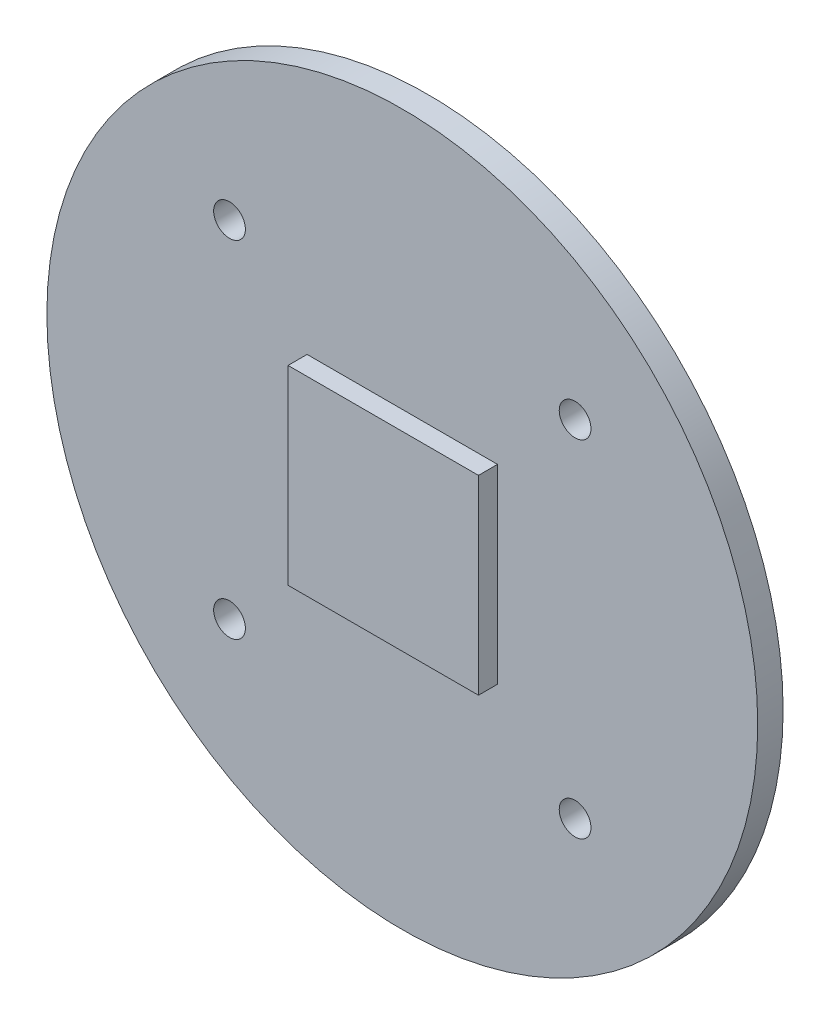
ISO-10303-21;
HEADER;
FILE_DESCRIPTION(('STEP AP214'),'2;1');
FILE_NAME('part.step','',(''),(''),'','','');
FILE_SCHEMA(('AUTOMOTIVE_DESIGN { 1 0 10303 214 1 1 1 1 }'));
ENDSEC;
DATA;
#1=APPLICATION_CONTEXT('core data for automotive mechanical design processes');
#2=APPLICATION_PROTOCOL_DEFINITION('international standard','automotive_design',2000,#1);
#3=PRODUCT_CONTEXT('',#1,'mechanical');
#4=PRODUCT('Part','Part','',(#3));
#5=PRODUCT_RELATED_PRODUCT_CATEGORY('part','',(#4));
#6=PRODUCT_DEFINITION_FORMATION('','',#4);
#7=PRODUCT_DEFINITION_CONTEXT('part definition',#1,'design');
#8=PRODUCT_DEFINITION('design','',#6,#7);
#9=PRODUCT_DEFINITION_SHAPE('','',#8);
#10=(LENGTH_UNIT() NAMED_UNIT(*) SI_UNIT(.MILLI.,.METRE.));
#11=(NAMED_UNIT(*) PLANE_ANGLE_UNIT() SI_UNIT($,.RADIAN.));
#12=(NAMED_UNIT(*) SI_UNIT($,.STERADIAN.) SOLID_ANGLE_UNIT());
#13=UNCERTAINTY_MEASURE_WITH_UNIT(LENGTH_MEASURE(1.E-05),#10,'distance_accuracy_value','');
#14=(GEOMETRIC_REPRESENTATION_CONTEXT(3) GLOBAL_UNCERTAINTY_ASSIGNED_CONTEXT((#13)) GLOBAL_UNIT_ASSIGNED_CONTEXT((#10,
#11,#12)) REPRESENTATION_CONTEXT('',''));
#15=CARTESIAN_POINT('',(0.,0.,0.));
#16=DIRECTION('',(0.,0.,1.));
#17=DIRECTION('',(1.,0.,0.));
#18=AXIS2_PLACEMENT_3D('',#15,#16,#17);
#19=CARTESIAN_POINT('',(0.,0.,0.));
#20=DIRECTION('',(0.,0.,1.));
#21=DIRECTION('',(1.,0.,0.));
#22=AXIS2_PLACEMENT_3D('',#19,#20,#21);
#23=PLANE('',#22);
#24=CARTESIAN_POINT('',(-13.611805537841,13.6118055378411,0.));
#25=DIRECTION('',(0.,0.,-1.));
#26=DIRECTION('',(-1.,0.,0.));
#27=AXIS2_PLACEMENT_3D('',#24,#25,#26);
#28=CIRCLE('',#27,1.25);
#29=CARTESIAN_POINT('',(-14.861805537841,13.6118055378411,0.));
#30=VERTEX_POINT('',#29);
#31=EDGE_CURVE('E250',#30,#30,#28,.T.);
#32=ORIENTED_EDGE('',*,*,#31,.F.);
#33=EDGE_LOOP('',(#32));
#34=FACE_BOUND('',#33,.T.);
#35=CARTESIAN_POINT('',(-13.6118055378415,-13.611805537841,0.));
#36=DIRECTION('',(0.,0.,-1.));
#37=DIRECTION('',(-1.,0.,0.));
#38=AXIS2_PLACEMENT_3D('',#35,#36,#37);
#39=CIRCLE('',#38,1.25);
#40=CARTESIAN_POINT('',(-14.8618055378415,-13.611805537841,0.));
#41=VERTEX_POINT('',#40);
#42=EDGE_CURVE('E253',#41,#41,#39,.T.);
#43=ORIENTED_EDGE('',*,*,#42,.F.);
#44=EDGE_LOOP('',(#43));
#45=FACE_BOUND('',#44,.T.);
#46=CARTESIAN_POINT('',(13.6118055378406,-13.6118055378415,0.));
#47=DIRECTION('',(0.,0.,-1.));
#48=DIRECTION('',(-1.,0.,0.));
#49=AXIS2_PLACEMENT_3D('',#46,#47,#48);
#50=CIRCLE('',#49,1.25);
#51=CARTESIAN_POINT('',(12.3618055378406,-13.6118055378415,0.));
#52=VERTEX_POINT('',#51);
#53=EDGE_CURVE('E249',#52,#52,#50,.T.);
#54=ORIENTED_EDGE('',*,*,#53,.F.);
#55=EDGE_LOOP('',(#54));
#56=FACE_BOUND('',#55,.T.);
#57=CARTESIAN_POINT('',(13.6118055378411,13.6118055378406,0.));
#58=DIRECTION('',(0.,0.,-1.));
#59=DIRECTION('',(-1.,0.,0.));
#60=AXIS2_PLACEMENT_3D('',#57,#58,#59);
#61=CIRCLE('',#60,1.25);
#62=CARTESIAN_POINT('',(12.3618055378411,13.6118055378406,0.));
#63=VERTEX_POINT('',#62);
#64=EDGE_CURVE('E222',#63,#63,#61,.T.);
#65=ORIENTED_EDGE('',*,*,#64,.F.);
#66=EDGE_LOOP('',(#65));
#67=FACE_BOUND('',#66,.T.);
#68=DIRECTION('',(0.,1.,0.));
#69=VECTOR('',#68,1.);
#70=CARTESIAN_POINT('',(-24.,-10.,0.));
#71=LINE('',#70,#69);
#72=CARTESIAN_POINT('',(-24.,-10.,0.));
#73=VERTEX_POINT('',#72);
#74=CARTESIAN_POINT('',(-24.,10.,0.));
#75=VERTEX_POINT('',#74);
#76=EDGE_CURVE('E145',#73,#75,#71,.T.);
#77=ORIENTED_EDGE('',*,*,#76,.F.);
#78=DIRECTION('',(-1.,0.,0.));
#79=VECTOR('',#78,1.);
#80=CARTESIAN_POINT('',(-14.,-10.,0.));
#81=LINE('',#80,#79);
#82=CARTESIAN_POINT('',(-14.,-10.,0.));
#83=VERTEX_POINT('',#82);
#84=EDGE_CURVE('E158',#83,#73,#81,.T.);
#85=ORIENTED_EDGE('',*,*,#84,.F.);
#86=DIRECTION('',(0.,-1.,0.));
#87=VECTOR('',#86,1.);
#88=CARTESIAN_POINT('',(-14.,-10.,0.));
#89=LINE('',#88,#87);
#90=CARTESIAN_POINT('',(-14.,10.,0.));
#91=VERTEX_POINT('',#90);
#92=EDGE_CURVE('E167',#91,#83,#89,.T.);
#93=ORIENTED_EDGE('',*,*,#92,.F.);
#94=DIRECTION('',(1.,0.,0.));
#95=VECTOR('',#94,1.);
#96=CARTESIAN_POINT('',(-14.,10.,0.));
#97=LINE('',#96,#95);
#98=EDGE_CURVE('E148',#75,#91,#97,.T.);
#99=ORIENTED_EDGE('',*,*,#98,.F.);
#100=EDGE_LOOP('',(#77,#85,#93,#99));
#101=FACE_BOUND('',#100,.T.);
#102=CARTESIAN_POINT('',(0.,0.,0.));
#103=DIRECTION('',(0.,0.,1.));
#104=DIRECTION('',(1.,0.,0.));
#105=AXIS2_PLACEMENT_3D('',#102,#103,#104);
#106=CIRCLE('',#105,28.);
#107=CARTESIAN_POINT('',(28.,0.,0.));
#108=VERTEX_POINT('',#107);
#109=EDGE_CURVE('E42',#108,#108,#106,.T.);
#110=ORIENTED_EDGE('',*,*,#109,.F.);
#111=EDGE_LOOP('',(#110));
#112=FACE_BOUND('',#111,.T.);
#113=DIRECTION('',(0.,1.,0.));
#114=VECTOR('',#113,1.);
#115=CARTESIAN_POINT('',(-7.5,-7.5,0.));
#116=LINE('',#115,#114);
#117=CARTESIAN_POINT('',(-7.5,-7.5,0.));
#118=VERTEX_POINT('',#117);
#119=CARTESIAN_POINT('',(-7.5,7.5,0.));
#120=VERTEX_POINT('',#119);
#121=EDGE_CURVE('E144',#118,#120,#116,.T.);
#122=ORIENTED_EDGE('',*,*,#121,.F.);
#123=DIRECTION('',(-1.,0.,0.));
#124=VECTOR('',#123,1.);
#125=CARTESIAN_POINT('',(7.5,-7.5,0.));
#126=LINE('',#125,#124);
#127=CARTESIAN_POINT('',(7.5,-7.5,0.));
#128=VERTEX_POINT('',#127);
#129=EDGE_CURVE('E141',#128,#118,#126,.T.);
#130=ORIENTED_EDGE('',*,*,#129,.F.);
#131=DIRECTION('',(0.,-1.,0.));
#132=VECTOR('',#131,1.);
#133=CARTESIAN_POINT('',(7.5,-7.5,0.));
#134=LINE('',#133,#132);
#135=CARTESIAN_POINT('',(7.5,7.5,0.));
#136=VERTEX_POINT('',#135);
#137=EDGE_CURVE('E55',#136,#128,#134,.T.);
#138=ORIENTED_EDGE('',*,*,#137,.F.);
#139=DIRECTION('',(1.,0.,0.));
#140=VECTOR('',#139,1.);
#141=CARTESIAN_POINT('',(7.5,7.5,0.));
#142=LINE('',#141,#140);
#143=EDGE_CURVE('E50',#120,#136,#142,.T.);
#144=ORIENTED_EDGE('',*,*,#143,.F.);
#145=EDGE_LOOP('',(#122,#130,#138,#144));
#146=FACE_BOUND('',#145,.T.);
#147=ADVANCED_FACE('F33',(#34,#45,#56,#67,#101,#112,#146),#23,.F.);
#148=CARTESIAN_POINT('',(0.,0.,2.));
#149=DIRECTION('',(0.,0.,-1.));
#150=DIRECTION('',(-1.,0.,0.));
#151=AXIS2_PLACEMENT_3D('',#148,#149,#150);
#152=CYLINDRICAL_SURFACE('',#151,28.);
#153=CARTESIAN_POINT('',(0.,0.,2.));
#154=DIRECTION('',(0.,0.,1.));
#155=DIRECTION('',(1.,0.,0.));
#156=AXIS2_PLACEMENT_3D('',#153,#154,#155);
#157=CIRCLE('',#156,28.);
#158=CARTESIAN_POINT('',(28.,0.,2.));
#159=VERTEX_POINT('',#158);
#160=EDGE_CURVE('E11',#159,#159,#157,.T.);
#161=ORIENTED_EDGE('',*,*,#160,.F.);
#162=EDGE_LOOP('',(#161));
#163=FACE_BOUND('',#162,.T.);
#164=ORIENTED_EDGE('',*,*,#109,.T.);
#165=EDGE_LOOP('',(#164));
#166=FACE_BOUND('',#165,.T.);
#167=ADVANCED_FACE('F35',(#163,#166),#152,.T.);
#168=CARTESIAN_POINT('',(0.,0.,2.));
#169=DIRECTION('',(0.,0.,1.));
#170=DIRECTION('',(1.,0.,0.));
#171=AXIS2_PLACEMENT_3D('',#168,#169,#170);
#172=PLANE('',#171);
#173=CARTESIAN_POINT('',(-13.611805537841,13.6118055378411,2.));
#174=DIRECTION('',(0.,0.,1.));
#175=DIRECTION('',(1.,0.,0.));
#176=AXIS2_PLACEMENT_3D('',#173,#174,#175);
#177=CIRCLE('',#176,1.25);
#178=CARTESIAN_POINT('',(-12.361805537841,13.6118055378411,2.));
#179=VERTEX_POINT('',#178);
#180=EDGE_CURVE('E37',#179,#179,#177,.T.);
#181=ORIENTED_EDGE('',*,*,#180,.F.);
#182=EDGE_LOOP('',(#181));
#183=FACE_BOUND('',#182,.T.);
#184=CARTESIAN_POINT('',(-13.6118055378415,-13.611805537841,2.));
#185=DIRECTION('',(0.,0.,1.));
#186=DIRECTION('',(1.,0.,0.));
#187=AXIS2_PLACEMENT_3D('',#184,#185,#186);
#188=CIRCLE('',#187,1.25);
#189=CARTESIAN_POINT('',(-12.3618055378415,-13.611805537841,2.));
#190=VERTEX_POINT('',#189);
#191=EDGE_CURVE('E224',#190,#190,#188,.T.);
#192=ORIENTED_EDGE('',*,*,#191,.F.);
#193=EDGE_LOOP('',(#192));
#194=FACE_BOUND('',#193,.T.);
#195=CARTESIAN_POINT('',(13.6118055378406,-13.6118055378415,2.));
#196=DIRECTION('',(0.,0.,1.));
#197=DIRECTION('',(1.,0.,0.));
#198=AXIS2_PLACEMENT_3D('',#195,#196,#197);
#199=CIRCLE('',#198,1.25);
#200=CARTESIAN_POINT('',(14.8618055378406,-13.6118055378415,2.));
#201=VERTEX_POINT('',#200);
#202=EDGE_CURVE('E221',#201,#201,#199,.T.);
#203=ORIENTED_EDGE('',*,*,#202,.F.);
#204=EDGE_LOOP('',(#203));
#205=FACE_BOUND('',#204,.T.);
#206=CARTESIAN_POINT('',(13.6118055378411,13.6118055378406,2.));
#207=DIRECTION('',(0.,0.,1.));
#208=DIRECTION('',(1.,0.,0.));
#209=AXIS2_PLACEMENT_3D('',#206,#207,#208);
#210=CIRCLE('',#209,1.25);
#211=CARTESIAN_POINT('',(14.8618055378411,13.6118055378406,2.));
#212=VERTEX_POINT('',#211);
#213=EDGE_CURVE('E218',#212,#212,#210,.T.);
#214=ORIENTED_EDGE('',*,*,#213,.F.);
#215=EDGE_LOOP('',(#214));
#216=FACE_BOUND('',#215,.T.);
#217=DIRECTION('',(0.,1.,0.));
#218=VECTOR('',#217,1.);
#219=CARTESIAN_POINT('',(7.5,-7.5,2.));
#220=LINE('',#219,#218);
#221=CARTESIAN_POINT('',(7.5,-7.5,2.));
#222=VERTEX_POINT('',#221);
#223=CARTESIAN_POINT('',(7.5,7.5,2.));
#224=VERTEX_POINT('',#223);
#225=EDGE_CURVE('E183',#222,#224,#220,.T.);
#226=ORIENTED_EDGE('',*,*,#225,.F.);
#227=DIRECTION('',(1.,0.,0.));
#228=VECTOR('',#227,1.);
#229=CARTESIAN_POINT('',(-7.5,-7.5,2.));
#230=LINE('',#229,#228);
#231=CARTESIAN_POINT('',(-7.5,-7.5,2.));
#232=VERTEX_POINT('',#231);
#233=EDGE_CURVE('E188',#232,#222,#230,.T.);
#234=ORIENTED_EDGE('',*,*,#233,.F.);
#235=DIRECTION('',(0.,-1.,0.));
#236=VECTOR('',#235,1.);
#237=CARTESIAN_POINT('',(-7.5,-7.5,2.));
#238=LINE('',#237,#236);
#239=CARTESIAN_POINT('',(-7.5,7.5,2.));
#240=VERTEX_POINT('',#239);
#241=EDGE_CURVE('E200',#240,#232,#238,.T.);
#242=ORIENTED_EDGE('',*,*,#241,.F.);
#243=DIRECTION('',(-1.,0.,0.));
#244=VECTOR('',#243,1.);
#245=CARTESIAN_POINT('',(-7.5,7.5,2.));
#246=LINE('',#245,#244);
#247=EDGE_CURVE('E197',#224,#240,#246,.T.);
#248=ORIENTED_EDGE('',*,*,#247,.F.);
#249=EDGE_LOOP('',(#226,#234,#242,#248));
#250=FACE_BOUND('',#249,.T.);
#251=ORIENTED_EDGE('',*,*,#160,.T.);
#252=EDGE_LOOP('',(#251));
#253=FACE_BOUND('',#252,.T.);
#254=ADVANCED_FACE('F270',(#183,#194,#205,#216,#250,#253),#172,.T.);
#255=CARTESIAN_POINT('',(7.5,-7.5,3.5));
#256=DIRECTION('',(-1.,0.,0.));
#257=DIRECTION('',(0.,0.,1.));
#258=AXIS2_PLACEMENT_3D('',#255,#256,#257);
#259=PLANE('',#258);
#260=ORIENTED_EDGE('',*,*,#225,.T.);
#261=DIRECTION('',(0.,0.,-1.));
#262=VECTOR('',#261,1.);
#263=CARTESIAN_POINT('',(7.5,7.5,3.5));
#264=LINE('',#263,#262);
#265=CARTESIAN_POINT('',(7.5,7.5,3.5));
#266=VERTEX_POINT('',#265);
#267=EDGE_CURVE('E213',#266,#224,#264,.T.);
#268=ORIENTED_EDGE('',*,*,#267,.F.);
#269=DIRECTION('',(0.,1.,0.));
#270=VECTOR('',#269,1.);
#271=CARTESIAN_POINT('',(7.5,-7.5,3.5));
#272=LINE('',#271,#270);
#273=CARTESIAN_POINT('',(7.5,-7.5,3.5));
#274=VERTEX_POINT('',#273);
#275=EDGE_CURVE('E184',#274,#266,#272,.T.);
#276=ORIENTED_EDGE('',*,*,#275,.F.);
#277=DIRECTION('',(0.,0.,-1.));
#278=VECTOR('',#277,1.);
#279=CARTESIAN_POINT('',(7.5,-7.5,3.5));
#280=LINE('',#279,#278);
#281=EDGE_CURVE('E194',#274,#222,#280,.T.);
#282=ORIENTED_EDGE('',*,*,#281,.T.);
#283=EDGE_LOOP('',(#260,#268,#276,#282));
#284=FACE_BOUND('',#283,.T.);
#285=ADVANCED_FACE('F277',(#284),#259,.F.);
#286=CARTESIAN_POINT('',(-7.5,7.5,3.5));
#287=DIRECTION('',(0.,-1.,0.));
#288=DIRECTION('',(0.,0.,-1.));
#289=AXIS2_PLACEMENT_3D('',#286,#287,#288);
#290=PLANE('',#289);
#291=ORIENTED_EDGE('',*,*,#247,.T.);
#292=DIRECTION('',(0.,0.,-1.));
#293=VECTOR('',#292,1.);
#294=CARTESIAN_POINT('',(-7.5,7.5,3.5));
#295=LINE('',#294,#293);
#296=CARTESIAN_POINT('',(-7.5,7.5,3.5));
#297=VERTEX_POINT('',#296);
#298=EDGE_CURVE('E210',#297,#240,#295,.T.);
#299=ORIENTED_EDGE('',*,*,#298,.F.);
#300=DIRECTION('',(-1.,0.,0.));
#301=VECTOR('',#300,1.);
#302=CARTESIAN_POINT('',(-7.5,7.5,3.5));
#303=LINE('',#302,#301);
#304=EDGE_CURVE('E187',#266,#297,#303,.T.);
#305=ORIENTED_EDGE('',*,*,#304,.F.);
#306=ORIENTED_EDGE('',*,*,#267,.T.);
#307=EDGE_LOOP('',(#291,#299,#305,#306));
#308=FACE_BOUND('',#307,.T.);
#309=ADVANCED_FACE('F285',(#308),#290,.F.);
#310=CARTESIAN_POINT('',(-7.5,-7.5,3.5));
#311=DIRECTION('',(1.,0.,0.));
#312=DIRECTION('',(0.,0.,-1.));
#313=AXIS2_PLACEMENT_3D('',#310,#311,#312);
#314=PLANE('',#313);
#315=ORIENTED_EDGE('',*,*,#241,.T.);
#316=DIRECTION('',(0.,0.,-1.));
#317=VECTOR('',#316,1.);
#318=CARTESIAN_POINT('',(-7.5,-7.5,3.5));
#319=LINE('',#318,#317);
#320=CARTESIAN_POINT('',(-7.5,-7.5,3.5));
#321=VERTEX_POINT('',#320);
#322=EDGE_CURVE('E207',#321,#232,#319,.T.);
#323=ORIENTED_EDGE('',*,*,#322,.F.);
#324=DIRECTION('',(0.,-1.,0.));
#325=VECTOR('',#324,1.);
#326=CARTESIAN_POINT('',(-7.5,-7.5,3.5));
#327=LINE('',#326,#325);
#328=EDGE_CURVE('E190',#297,#321,#327,.T.);
#329=ORIENTED_EDGE('',*,*,#328,.F.);
#330=ORIENTED_EDGE('',*,*,#298,.T.);
#331=EDGE_LOOP('',(#315,#323,#329,#330));
#332=FACE_BOUND('',#331,.T.);
#333=ADVANCED_FACE('F292',(#332),#314,.F.);
#334=CARTESIAN_POINT('',(-7.5,-7.5,3.5));
#335=DIRECTION('',(0.,1.,0.));
#336=DIRECTION('',(0.,0.,1.));
#337=AXIS2_PLACEMENT_3D('',#334,#335,#336);
#338=PLANE('',#337);
#339=ORIENTED_EDGE('',*,*,#233,.T.);
#340=ORIENTED_EDGE('',*,*,#281,.F.);
#341=DIRECTION('',(1.,0.,0.));
#342=VECTOR('',#341,1.);
#343=CARTESIAN_POINT('',(-7.5,-7.5,3.5));
#344=LINE('',#343,#342);
#345=EDGE_CURVE('E192',#321,#274,#344,.T.);
#346=ORIENTED_EDGE('',*,*,#345,.F.);
#347=ORIENTED_EDGE('',*,*,#322,.T.);
#348=EDGE_LOOP('',(#339,#340,#346,#347));
#349=FACE_BOUND('',#348,.T.);
#350=ADVANCED_FACE('F296',(#349),#338,.F.);
#351=CARTESIAN_POINT('',(0.,0.,3.5));
#352=DIRECTION('',(0.,0.,-1.));
#353=DIRECTION('',(-1.,0.,0.));
#354=AXIS2_PLACEMENT_3D('',#351,#352,#353);
#355=PLANE('',#354);
#356=ORIENTED_EDGE('',*,*,#275,.T.);
#357=ORIENTED_EDGE('',*,*,#304,.T.);
#358=ORIENTED_EDGE('',*,*,#328,.T.);
#359=ORIENTED_EDGE('',*,*,#345,.T.);
#360=EDGE_LOOP('',(#356,#357,#358,#359));
#361=FACE_BOUND('',#360,.T.);
#362=ADVANCED_FACE('F300',(#361),#355,.F.);
#363=CARTESIAN_POINT('',(-24.,-10.,-1.5));
#364=DIRECTION('',(1.,0.,0.));
#365=DIRECTION('',(0.,1.,0.));
#366=AXIS2_PLACEMENT_3D('',#363,#364,#365);
#367=PLANE('',#366);
#368=ORIENTED_EDGE('',*,*,#76,.T.);
#369=DIRECTION('',(0.,0.,1.));
#370=VECTOR('',#369,1.);
#371=CARTESIAN_POINT('',(-24.,10.,-1.5));
#372=LINE('',#371,#370);
#373=CARTESIAN_POINT('',(-24.,10.,-1.5));
#374=VERTEX_POINT('',#373);
#375=EDGE_CURVE('E180',#374,#75,#372,.T.);
#376=ORIENTED_EDGE('',*,*,#375,.F.);
#377=DIRECTION('',(0.,1.,0.));
#378=VECTOR('',#377,1.);
#379=CARTESIAN_POINT('',(-24.,-10.,-1.5));
#380=LINE('',#379,#378);
#381=CARTESIAN_POINT('',(-24.,-10.,-1.5));
#382=VERTEX_POINT('',#381);
#383=EDGE_CURVE('E154',#382,#374,#380,.T.);
#384=ORIENTED_EDGE('',*,*,#383,.F.);
#385=DIRECTION('',(0.,0.,1.));
#386=VECTOR('',#385,1.);
#387=CARTESIAN_POINT('',(-24.,-10.,-1.5));
#388=LINE('',#387,#386);
#389=EDGE_CURVE('E163',#382,#73,#388,.T.);
#390=ORIENTED_EDGE('',*,*,#389,.T.);
#391=EDGE_LOOP('',(#368,#376,#384,#390));
#392=FACE_BOUND('',#391,.T.);
#393=ADVANCED_FACE('F304',(#392),#367,.F.);
#394=CARTESIAN_POINT('',(-14.,10.,-1.5));
#395=DIRECTION('',(0.,-1.,0.));
#396=DIRECTION('',(0.,0.,-1.));
#397=AXIS2_PLACEMENT_3D('',#394,#395,#396);
#398=PLANE('',#397);
#399=ORIENTED_EDGE('',*,*,#98,.T.);
#400=DIRECTION('',(0.,0.,1.));
#401=VECTOR('',#400,1.);
#402=CARTESIAN_POINT('',(-14.,10.,-1.5));
#403=LINE('',#402,#401);
#404=CARTESIAN_POINT('',(-14.,10.,-1.5));
#405=VERTEX_POINT('',#404);
#406=EDGE_CURVE('E177',#405,#91,#403,.T.);
#407=ORIENTED_EDGE('',*,*,#406,.F.);
#408=DIRECTION('',(1.,0.,0.));
#409=VECTOR('',#408,1.);
#410=CARTESIAN_POINT('',(-14.,10.,-1.5));
#411=LINE('',#410,#409);
#412=EDGE_CURVE('E157',#374,#405,#411,.T.);
#413=ORIENTED_EDGE('',*,*,#412,.F.);
#414=ORIENTED_EDGE('',*,*,#375,.T.);
#415=EDGE_LOOP('',(#399,#407,#413,#414));
#416=FACE_BOUND('',#415,.T.);
#417=ADVANCED_FACE('F308',(#416),#398,.F.);
#418=CARTESIAN_POINT('',(-14.,-10.,-1.5));
#419=DIRECTION('',(-1.,0.,0.));
#420=DIRECTION('',(0.,0.,1.));
#421=AXIS2_PLACEMENT_3D('',#418,#419,#420);
#422=PLANE('',#421);
#423=ORIENTED_EDGE('',*,*,#92,.T.);
#424=DIRECTION('',(0.,0.,1.));
#425=VECTOR('',#424,1.);
#426=CARTESIAN_POINT('',(-14.,-10.,-1.5));
#427=LINE('',#426,#425);
#428=CARTESIAN_POINT('',(-14.,-10.,-1.5));
#429=VERTEX_POINT('',#428);
#430=EDGE_CURVE('E174',#429,#83,#427,.T.);
#431=ORIENTED_EDGE('',*,*,#430,.F.);
#432=DIRECTION('',(0.,-1.,0.));
#433=VECTOR('',#432,1.);
#434=CARTESIAN_POINT('',(-14.,-10.,-1.5));
#435=LINE('',#434,#433);
#436=EDGE_CURVE('E160',#405,#429,#435,.T.);
#437=ORIENTED_EDGE('',*,*,#436,.F.);
#438=ORIENTED_EDGE('',*,*,#406,.T.);
#439=EDGE_LOOP('',(#423,#431,#437,#438));
#440=FACE_BOUND('',#439,.T.);
#441=ADVANCED_FACE('F312',(#440),#422,.F.);
#442=CARTESIAN_POINT('',(-14.,-10.,-1.5));
#443=DIRECTION('',(0.,1.,0.));
#444=DIRECTION('',(0.,0.,1.));
#445=AXIS2_PLACEMENT_3D('',#442,#443,#444);
#446=PLANE('',#445);
#447=ORIENTED_EDGE('',*,*,#84,.T.);
#448=ORIENTED_EDGE('',*,*,#389,.F.);
#449=DIRECTION('',(-1.,0.,0.));
#450=VECTOR('',#449,1.);
#451=CARTESIAN_POINT('',(-14.,-10.,-1.5));
#452=LINE('',#451,#450);
#453=EDGE_CURVE('E162',#429,#382,#452,.T.);
#454=ORIENTED_EDGE('',*,*,#453,.F.);
#455=ORIENTED_EDGE('',*,*,#430,.T.);
#456=EDGE_LOOP('',(#447,#448,#454,#455));
#457=FACE_BOUND('',#456,.T.);
#458=ADVANCED_FACE('F316',(#457),#446,.F.);
#459=CARTESIAN_POINT('',(0.,0.,-1.5));
#460=DIRECTION('',(0.,0.,1.));
#461=DIRECTION('',(1.,0.,0.));
#462=AXIS2_PLACEMENT_3D('',#459,#460,#461);
#463=PLANE('',#462);
#464=ORIENTED_EDGE('',*,*,#383,.T.);
#465=ORIENTED_EDGE('',*,*,#412,.T.);
#466=ORIENTED_EDGE('',*,*,#436,.T.);
#467=ORIENTED_EDGE('',*,*,#453,.T.);
#468=EDGE_LOOP('',(#464,#465,#466,#467));
#469=FACE_BOUND('',#468,.T.);
#470=ADVANCED_FACE('F320',(#469),#463,.F.);
#471=CARTESIAN_POINT('',(-7.5,-7.5,-1.5));
#472=DIRECTION('',(1.,0.,0.));
#473=DIRECTION('',(0.,0.,-1.));
#474=AXIS2_PLACEMENT_3D('',#471,#472,#473);
#475=PLANE('',#474);
#476=ORIENTED_EDGE('',*,*,#121,.T.);
#477=DIRECTION('',(0.,0.,1.));
#478=VECTOR('',#477,1.);
#479=CARTESIAN_POINT('',(-7.5,7.5,-1.5));
#480=LINE('',#479,#478);
#481=CARTESIAN_POINT('',(-7.5,7.5,-1.5));
#482=VERTEX_POINT('',#481);
#483=EDGE_CURVE('E125',#482,#120,#480,.T.);
#484=ORIENTED_EDGE('',*,*,#483,.F.);
#485=DIRECTION('',(0.,1.,0.));
#486=VECTOR('',#485,1.);
#487=CARTESIAN_POINT('',(-7.5,-7.5,-1.5));
#488=LINE('',#487,#486);
#489=CARTESIAN_POINT('',(-7.5,-7.5,-1.5));
#490=VERTEX_POINT('',#489);
#491=EDGE_CURVE('E132',#490,#482,#488,.T.);
#492=ORIENTED_EDGE('',*,*,#491,.F.);
#493=DIRECTION('',(0.,0.,1.));
#494=VECTOR('',#493,1.);
#495=CARTESIAN_POINT('',(-7.5,-7.5,-1.5));
#496=LINE('',#495,#494);
#497=EDGE_CURVE('E239',#490,#118,#496,.T.);
#498=ORIENTED_EDGE('',*,*,#497,.T.);
#499=EDGE_LOOP('',(#476,#484,#492,#498));
#500=FACE_BOUND('',#499,.T.);
#501=ADVANCED_FACE('F143',(#500),#475,.F.);
#502=CARTESIAN_POINT('',(7.5,7.5,-1.5));
#503=DIRECTION('',(0.,-1.,0.));
#504=DIRECTION('',(0.,0.,-1.));
#505=AXIS2_PLACEMENT_3D('',#502,#503,#504);
#506=PLANE('',#505);
#507=ORIENTED_EDGE('',*,*,#143,.T.);
#508=DIRECTION('',(0.,0.,1.));
#509=VECTOR('',#508,1.);
#510=CARTESIAN_POINT('',(7.5,7.5,-1.5));
#511=LINE('',#510,#509);
#512=CARTESIAN_POINT('',(7.5,7.5,-1.5));
#513=VERTEX_POINT('',#512);
#514=EDGE_CURVE('E128',#513,#136,#511,.T.);
#515=ORIENTED_EDGE('',*,*,#514,.F.);
#516=DIRECTION('',(1.,0.,0.));
#517=VECTOR('',#516,1.);
#518=CARTESIAN_POINT('',(7.5,7.5,-1.5));
#519=LINE('',#518,#517);
#520=EDGE_CURVE('E121',#482,#513,#519,.T.);
#521=ORIENTED_EDGE('',*,*,#520,.F.);
#522=ORIENTED_EDGE('',*,*,#483,.T.);
#523=EDGE_LOOP('',(#507,#515,#521,#522));
#524=FACE_BOUND('',#523,.T.);
#525=ADVANCED_FACE('F123',(#524),#506,.F.);
#526=CARTESIAN_POINT('',(7.5,-7.5,-1.5));
#527=DIRECTION('',(-1.,0.,0.));
#528=DIRECTION('',(0.,0.,1.));
#529=AXIS2_PLACEMENT_3D('',#526,#527,#528);
#530=PLANE('',#529);
#531=ORIENTED_EDGE('',*,*,#137,.T.);
#532=DIRECTION('',(0.,0.,1.));
#533=VECTOR('',#532,1.);
#534=CARTESIAN_POINT('',(7.5,-7.5,-1.5));
#535=LINE('',#534,#533);
#536=CARTESIAN_POINT('',(7.5,-7.5,-1.5));
#537=VERTEX_POINT('',#536);
#538=EDGE_CURVE('E150',#537,#128,#535,.T.);
#539=ORIENTED_EDGE('',*,*,#538,.F.);
#540=DIRECTION('',(0.,-1.,0.));
#541=VECTOR('',#540,1.);
#542=CARTESIAN_POINT('',(7.5,-7.5,-1.5));
#543=LINE('',#542,#541);
#544=EDGE_CURVE('E131',#513,#537,#543,.T.);
#545=ORIENTED_EDGE('',*,*,#544,.F.);
#546=ORIENTED_EDGE('',*,*,#514,.T.);
#547=EDGE_LOOP('',(#531,#539,#545,#546));
#548=FACE_BOUND('',#547,.T.);
#549=ADVANCED_FACE('F245',(#548),#530,.F.);
#550=CARTESIAN_POINT('',(7.5,-7.5,-1.5));
#551=DIRECTION('',(0.,1.,0.));
#552=DIRECTION('',(0.,0.,1.));
#553=AXIS2_PLACEMENT_3D('',#550,#551,#552);
#554=PLANE('',#553);
#555=ORIENTED_EDGE('',*,*,#129,.T.);
#556=ORIENTED_EDGE('',*,*,#497,.F.);
#557=DIRECTION('',(-1.,0.,0.));
#558=VECTOR('',#557,1.);
#559=CARTESIAN_POINT('',(7.5,-7.5,-1.5));
#560=LINE('',#559,#558);
#561=EDGE_CURVE('E137',#537,#490,#560,.T.);
#562=ORIENTED_EDGE('',*,*,#561,.F.);
#563=ORIENTED_EDGE('',*,*,#538,.T.);
#564=EDGE_LOOP('',(#555,#556,#562,#563));
#565=FACE_BOUND('',#564,.T.);
#566=ADVANCED_FACE('F243',(#565),#554,.F.);
#567=CARTESIAN_POINT('',(0.,0.,-1.5));
#568=DIRECTION('',(0.,0.,1.));
#569=DIRECTION('',(1.,0.,0.));
#570=AXIS2_PLACEMENT_3D('',#567,#568,#569);
#571=PLANE('',#570);
#572=ORIENTED_EDGE('',*,*,#491,.T.);
#573=ORIENTED_EDGE('',*,*,#520,.T.);
#574=ORIENTED_EDGE('',*,*,#544,.T.);
#575=ORIENTED_EDGE('',*,*,#561,.T.);
#576=EDGE_LOOP('',(#572,#573,#574,#575));
#577=FACE_BOUND('',#576,.T.);
#578=ADVANCED_FACE('F135',(#577),#571,.F.);
#579=CARTESIAN_POINT('',(13.6118055378411,13.6118055378406,10.));
#580=DIRECTION('',(0.,0.,-1.));
#581=DIRECTION('',(-1.,0.,0.));
#582=AXIS2_PLACEMENT_3D('',#579,#580,#581);
#583=CYLINDRICAL_SURFACE('',#582,1.25);
#584=ORIENTED_EDGE('',*,*,#213,.T.);
#585=EDGE_LOOP('',(#584));
#586=FACE_BOUND('',#585,.T.);
#587=ORIENTED_EDGE('',*,*,#64,.T.);
#588=EDGE_LOOP('',(#587));
#589=FACE_BOUND('',#588,.T.);
#590=ADVANCED_FACE('F335',(#586,#589),#583,.F.);
#591=CARTESIAN_POINT('',(13.6118055378406,-13.6118055378415,10.));
#592=DIRECTION('',(0.,0.,-1.));
#593=DIRECTION('',(-1.,0.,0.));
#594=AXIS2_PLACEMENT_3D('',#591,#592,#593);
#595=CYLINDRICAL_SURFACE('',#594,1.25);
#596=ORIENTED_EDGE('',*,*,#202,.T.);
#597=EDGE_LOOP('',(#596));
#598=FACE_BOUND('',#597,.T.);
#599=ORIENTED_EDGE('',*,*,#53,.T.);
#600=EDGE_LOOP('',(#599));
#601=FACE_BOUND('',#600,.T.);
#602=ADVANCED_FACE('F259',(#598,#601),#595,.F.);
#603=CARTESIAN_POINT('',(-13.6118055378415,-13.611805537841,10.));
#604=DIRECTION('',(0.,0.,-1.));
#605=DIRECTION('',(-1.,0.,0.));
#606=AXIS2_PLACEMENT_3D('',#603,#604,#605);
#607=CYLINDRICAL_SURFACE('',#606,1.25);
#608=ORIENTED_EDGE('',*,*,#191,.T.);
#609=EDGE_LOOP('',(#608));
#610=FACE_BOUND('',#609,.T.);
#611=ORIENTED_EDGE('',*,*,#42,.T.);
#612=EDGE_LOOP('',(#611));
#613=FACE_BOUND('',#612,.T.);
#614=ADVANCED_FACE('F342',(#610,#613),#607,.F.);
#615=CARTESIAN_POINT('',(-13.611805537841,13.6118055378411,10.));
#616=DIRECTION('',(0.,0.,-1.));
#617=DIRECTION('',(-1.,0.,0.));
#618=AXIS2_PLACEMENT_3D('',#615,#616,#617);
#619=CYLINDRICAL_SURFACE('',#618,1.25);
#620=ORIENTED_EDGE('',*,*,#180,.T.);
#621=EDGE_LOOP('',(#620));
#622=FACE_BOUND('',#621,.T.);
#623=ORIENTED_EDGE('',*,*,#31,.T.);
#624=EDGE_LOOP('',(#623));
#625=FACE_BOUND('',#624,.T.);
#626=ADVANCED_FACE('F339',(#622,#625),#619,.F.);
#627=CLOSED_SHELL('',(#147,#167,#254,#285,#309,#333,#350,#362,#393,#417,#441,#458,#470,#501,
#525,#549,#566,#578,#590,#602,#614,#626));
#628=MANIFOLD_SOLID_BREP('B2',#627);
#629=ADVANCED_BREP_SHAPE_REPRESENTATION('',(#18,#628),#14);
#630=SHAPE_DEFINITION_REPRESENTATION(#9,#629);
ENDSEC;
END-ISO-10303-21;
